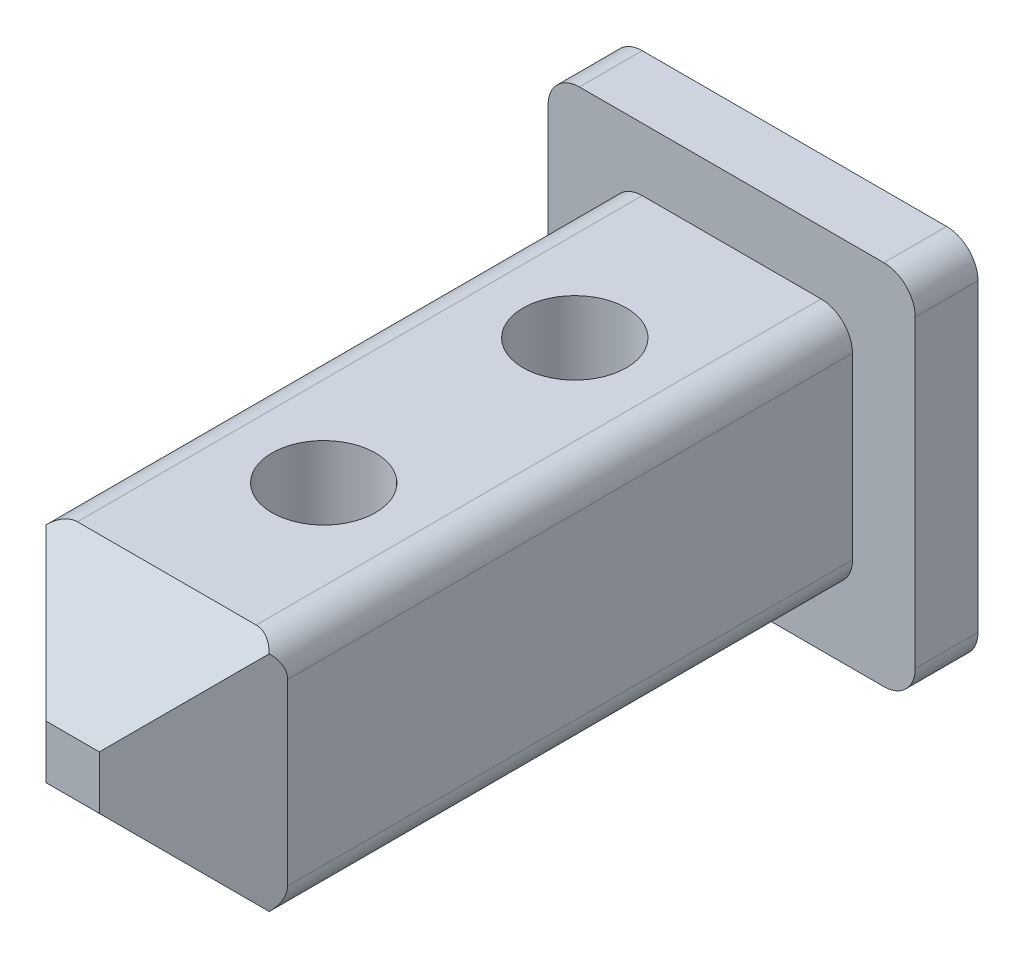
ISO-10303-21;
HEADER;
FILE_DESCRIPTION(('STEP AP214'),'2;1');
FILE_NAME('part.step','',(''),(''),'','','');
FILE_SCHEMA(('AUTOMOTIVE_DESIGN { 1 0 10303 214 1 1 1 1 }'));
ENDSEC;
DATA;
#1=APPLICATION_CONTEXT('core data for automotive mechanical design processes');
#2=APPLICATION_PROTOCOL_DEFINITION('international standard','automotive_design',2000,#1);
#3=PRODUCT_CONTEXT('',#1,'mechanical');
#4=PRODUCT('Part','Part','',(#3));
#5=PRODUCT_RELATED_PRODUCT_CATEGORY('part','',(#4));
#6=PRODUCT_DEFINITION_FORMATION('','',#4);
#7=PRODUCT_DEFINITION_CONTEXT('part definition',#1,'design');
#8=PRODUCT_DEFINITION('design','',#6,#7);
#9=PRODUCT_DEFINITION_SHAPE('','',#8);
#10=(LENGTH_UNIT() NAMED_UNIT(*) SI_UNIT(.MILLI.,.METRE.));
#11=(NAMED_UNIT(*) PLANE_ANGLE_UNIT() SI_UNIT($,.RADIAN.));
#12=(NAMED_UNIT(*) SI_UNIT($,.STERADIAN.) SOLID_ANGLE_UNIT());
#13=UNCERTAINTY_MEASURE_WITH_UNIT(LENGTH_MEASURE(1.E-05),#10,'distance_accuracy_value','');
#14=(GEOMETRIC_REPRESENTATION_CONTEXT(3) GLOBAL_UNCERTAINTY_ASSIGNED_CONTEXT((#13)) GLOBAL_UNIT_ASSIGNED_CONTEXT((#10,
#11,#12)) REPRESENTATION_CONTEXT('',''));
#15=CARTESIAN_POINT('',(0.,0.,0.));
#16=DIRECTION('',(0.,0.,1.));
#17=DIRECTION('',(1.,0.,0.));
#18=AXIS2_PLACEMENT_3D('',#15,#16,#17);
#19=CARTESIAN_POINT('',(3.85,3.85,21.));
#20=DIRECTION('',(-1.,0.,0.));
#21=DIRECTION('',(0.,-1.,0.));
#22=AXIS2_PLACEMENT_3D('',#19,#20,#21);
#23=PLANE('',#22);
#24=DIRECTION('',(0.,-1.,0.));
#25=VECTOR('',#24,1.);
#26=CARTESIAN_POINT('',(3.85,-3.85,18.));
#27=LINE('',#26,#25);
#28=CARTESIAN_POINT('',(3.85,2.85,18.));
#29=VERTEX_POINT('',#28);
#30=CARTESIAN_POINT('',(3.85,-2.85,18.));
#31=VERTEX_POINT('',#30);
#32=EDGE_CURVE('E213',#29,#31,#27,.T.);
#33=ORIENTED_EDGE('',*,*,#32,.T.);
#34=DIRECTION('',(0.,0.,-1.));
#35=VECTOR('',#34,1.);
#36=CARTESIAN_POINT('',(3.85,-2.85,21.));
#37=LINE('',#36,#35);
#38=CARTESIAN_POINT('',(3.85,-2.85,0.));
#39=VERTEX_POINT('',#38);
#40=EDGE_CURVE('E287',#31,#39,#37,.T.);
#41=ORIENTED_EDGE('',*,*,#40,.T.);
#42=DIRECTION('',(0.,1.,0.));
#43=VECTOR('',#42,1.);
#44=CARTESIAN_POINT('',(3.85,3.85,0.));
#45=LINE('',#44,#43);
#46=CARTESIAN_POINT('',(3.85,2.85,0.));
#47=VERTEX_POINT('',#46);
#48=EDGE_CURVE('E300',#39,#47,#45,.T.);
#49=ORIENTED_EDGE('',*,*,#48,.T.);
#50=DIRECTION('',(0.,0.,-1.));
#51=VECTOR('',#50,1.);
#52=CARTESIAN_POINT('',(3.85,2.85,21.));
#53=LINE('',#52,#51);
#54=EDGE_CURVE('E56',#47,#29,#53,.F.);
#55=ORIENTED_EDGE('',*,*,#54,.T.);
#56=EDGE_LOOP('',(#33,#41,#49,#55));
#57=FACE_BOUND('',#56,.T.);
#58=ADVANCED_FACE('F34',(#57),#23,.F.);
#59=CARTESIAN_POINT('',(-3.85,3.85,21.));
#60=DIRECTION('',(0.,-1.,0.));
#61=DIRECTION('',(1.,0.,0.));
#62=AXIS2_PLACEMENT_3D('',#59,#60,#61);
#63=PLANE('',#62);
#64=CARTESIAN_POINT('',(0.,3.85,5.));
#65=DIRECTION('',(0.,-1.,0.));
#66=DIRECTION('',(1.,0.,0.));
#67=AXIS2_PLACEMENT_3D('',#64,#65,#66);
#68=CIRCLE('',#67,1.65);
#69=CARTESIAN_POINT('',(1.65,3.85,5.));
#70=VERTEX_POINT('',#69);
#71=EDGE_CURVE('E221',#70,#70,#68,.T.);
#72=ORIENTED_EDGE('',*,*,#71,.T.);
#73=EDGE_LOOP('',(#72));
#74=FACE_BOUND('',#73,.T.);
#75=CARTESIAN_POINT('',(0.,3.85,13.));
#76=DIRECTION('',(0.,-1.,0.));
#77=DIRECTION('',(1.,0.,0.));
#78=AXIS2_PLACEMENT_3D('',#75,#76,#77);
#79=CIRCLE('',#78,1.65);
#80=CARTESIAN_POINT('',(1.65,3.85,13.));
#81=VERTEX_POINT('',#80);
#82=EDGE_CURVE('E354',#81,#81,#79,.T.);
#83=ORIENTED_EDGE('',*,*,#82,.T.);
#84=EDGE_LOOP('',(#83));
#85=FACE_BOUND('',#84,.T.);
#86=DIRECTION('',(-1.,0.,0.));
#87=VECTOR('',#86,1.);
#88=CARTESIAN_POINT('',(-3.85,3.85,0.));
#89=LINE('',#88,#87);
#90=CARTESIAN_POINT('',(2.85,3.85,0.));
#91=VERTEX_POINT('',#90);
#92=CARTESIAN_POINT('',(-2.85,3.85,0.));
#93=VERTEX_POINT('',#92);
#94=EDGE_CURVE('E324',#91,#93,#89,.T.);
#95=ORIENTED_EDGE('',*,*,#94,.T.);
#96=DIRECTION('',(0.,0.,-1.));
#97=VECTOR('',#96,1.);
#98=CARTESIAN_POINT('',(-2.85,3.85,21.));
#99=LINE('',#98,#97);
#100=CARTESIAN_POINT('',(-2.85,3.85,18.));
#101=VERTEX_POINT('',#100);
#102=EDGE_CURVE('E267',#93,#101,#99,.F.);
#103=ORIENTED_EDGE('',*,*,#102,.T.);
#104=DIRECTION('',(1.,0.,0.));
#105=VECTOR('',#104,1.);
#106=CARTESIAN_POINT('',(3.85,3.85,18.));
#107=LINE('',#106,#105);
#108=CARTESIAN_POINT('',(2.85,3.85,18.));
#109=VERTEX_POINT('',#108);
#110=EDGE_CURVE('E215',#101,#109,#107,.T.);
#111=ORIENTED_EDGE('',*,*,#110,.T.);
#112=DIRECTION('',(0.,0.,-1.));
#113=VECTOR('',#112,1.);
#114=CARTESIAN_POINT('',(2.85,3.85,21.));
#115=LINE('',#114,#113);
#116=EDGE_CURVE('E264',#109,#91,#115,.T.);
#117=ORIENTED_EDGE('',*,*,#116,.T.);
#118=EDGE_LOOP('',(#95,#103,#111,#117));
#119=FACE_BOUND('',#118,.T.);
#120=ADVANCED_FACE('F378',(#74,#85,#119),#63,.F.);
#121=CARTESIAN_POINT('',(-3.85,3.85,21.));
#122=DIRECTION('',(1.,0.,0.));
#123=DIRECTION('',(0.,1.,0.));
#124=AXIS2_PLACEMENT_3D('',#121,#122,#123);
#125=PLANE('',#124);
#126=DIRECTION('',(0.,1.,0.));
#127=VECTOR('',#126,1.);
#128=CARTESIAN_POINT('',(-3.85,3.85,18.));
#129=LINE('',#128,#127);
#130=CARTESIAN_POINT('',(-3.85,-2.85,18.));
#131=VERTEX_POINT('',#130);
#132=CARTESIAN_POINT('',(-3.85,2.85,18.));
#133=VERTEX_POINT('',#132);
#134=EDGE_CURVE('E207',#131,#133,#129,.T.);
#135=ORIENTED_EDGE('',*,*,#134,.T.);
#136=DIRECTION('',(0.,0.,-1.));
#137=VECTOR('',#136,1.);
#138=CARTESIAN_POINT('',(-3.85,2.85,21.));
#139=LINE('',#138,#137);
#140=CARTESIAN_POINT('',(-3.85,2.85,0.));
#141=VERTEX_POINT('',#140);
#142=EDGE_CURVE('E261',#133,#141,#139,.T.);
#143=ORIENTED_EDGE('',*,*,#142,.T.);
#144=DIRECTION('',(0.,-1.,0.));
#145=VECTOR('',#144,1.);
#146=CARTESIAN_POINT('',(-3.85,3.85,0.));
#147=LINE('',#146,#145);
#148=CARTESIAN_POINT('',(-3.85,-2.85,0.));
#149=VERTEX_POINT('',#148);
#150=EDGE_CURVE('E200',#141,#149,#147,.T.);
#151=ORIENTED_EDGE('',*,*,#150,.T.);
#152=DIRECTION('',(0.,0.,-1.));
#153=VECTOR('',#152,1.);
#154=CARTESIAN_POINT('',(-3.85,-2.85,21.));
#155=LINE('',#154,#153);
#156=EDGE_CURVE('E259',#149,#131,#155,.F.);
#157=ORIENTED_EDGE('',*,*,#156,.T.);
#158=EDGE_LOOP('',(#135,#143,#151,#157));
#159=FACE_BOUND('',#158,.T.);
#160=ADVANCED_FACE('F321',(#159),#125,.F.);
#161=CARTESIAN_POINT('',(-3.85,-3.85,21.));
#162=DIRECTION('',(0.,1.,0.));
#163=DIRECTION('',(-1.,0.,0.));
#164=AXIS2_PLACEMENT_3D('',#161,#162,#163);
#165=PLANE('',#164);
#166=CARTESIAN_POINT('',(0.,-3.85,5.));
#167=DIRECTION('',(0.,-1.,0.));
#168=DIRECTION('',(1.,0.,0.));
#169=AXIS2_PLACEMENT_3D('',#166,#167,#168);
#170=CIRCLE('',#169,1.65);
#171=CARTESIAN_POINT('',(1.65,-3.85,5.));
#172=VERTEX_POINT('',#171);
#173=EDGE_CURVE('E357',#172,#172,#170,.T.);
#174=ORIENTED_EDGE('',*,*,#173,.F.);
#175=EDGE_LOOP('',(#174));
#176=FACE_BOUND('',#175,.T.);
#177=CARTESIAN_POINT('',(0.,-3.85,13.));
#178=DIRECTION('',(0.,-1.,0.));
#179=DIRECTION('',(1.,0.,0.));
#180=AXIS2_PLACEMENT_3D('',#177,#178,#179);
#181=CIRCLE('',#180,1.65);
#182=CARTESIAN_POINT('',(1.65,-3.85,13.));
#183=VERTEX_POINT('',#182);
#184=EDGE_CURVE('E358',#183,#183,#181,.T.);
#185=ORIENTED_EDGE('',*,*,#184,.F.);
#186=EDGE_LOOP('',(#185));
#187=FACE_BOUND('',#186,.T.);
#188=DIRECTION('',(-1.,0.,0.));
#189=VECTOR('',#188,1.);
#190=CARTESIAN_POINT('',(-3.85,-3.85,18.));
#191=LINE('',#190,#189);
#192=CARTESIAN_POINT('',(2.85,-3.85,18.));
#193=VERTEX_POINT('',#192);
#194=CARTESIAN_POINT('',(-2.85,-3.85,18.));
#195=VERTEX_POINT('',#194);
#196=EDGE_CURVE('E210',#193,#195,#191,.T.);
#197=ORIENTED_EDGE('',*,*,#196,.T.);
#198=DIRECTION('',(0.,0.,-1.));
#199=VECTOR('',#198,1.);
#200=CARTESIAN_POINT('',(-2.85,-3.85,21.));
#201=LINE('',#200,#199);
#202=CARTESIAN_POINT('',(-2.85,-3.85,0.));
#203=VERTEX_POINT('',#202);
#204=EDGE_CURVE('E279',#195,#203,#201,.T.);
#205=ORIENTED_EDGE('',*,*,#204,.T.);
#206=DIRECTION('',(1.,0.,0.));
#207=VECTOR('',#206,1.);
#208=CARTESIAN_POINT('',(-3.85,-3.85,0.));
#209=LINE('',#208,#207);
#210=CARTESIAN_POINT('',(2.85,-3.85,0.));
#211=VERTEX_POINT('',#210);
#212=EDGE_CURVE('E197',#203,#211,#209,.T.);
#213=ORIENTED_EDGE('',*,*,#212,.T.);
#214=DIRECTION('',(0.,0.,-1.));
#215=VECTOR('',#214,1.);
#216=CARTESIAN_POINT('',(2.85,-3.85,21.));
#217=LINE('',#216,#215);
#218=EDGE_CURVE('E277',#211,#193,#217,.F.);
#219=ORIENTED_EDGE('',*,*,#218,.T.);
#220=EDGE_LOOP('',(#197,#205,#213,#219));
#221=FACE_BOUND('',#220,.T.);
#222=ADVANCED_FACE('F305',(#176,#187,#221),#165,.F.);
#223=CARTESIAN_POINT('',(0.,0.,21.));
#224=DIRECTION('',(0.,0.,1.));
#225=DIRECTION('',(1.,0.,0.));
#226=AXIS2_PLACEMENT_3D('',#223,#224,#225);
#227=PLANE('',#226);
#228=DIRECTION('',(-1.,0.,0.));
#229=VECTOR('',#228,1.);
#230=CARTESIAN_POINT('',(-3.85,0.849999999999999,21.));
#231=LINE('',#230,#229);
#232=CARTESIAN_POINT('',(0.849999999999997,0.849999999999999,21.));
#233=VERTEX_POINT('',#232);
#234=CARTESIAN_POINT('',(-0.849999999999998,0.849999999999999,21.));
#235=VERTEX_POINT('',#234);
#236=EDGE_CURVE('E177',#233,#235,#231,.T.);
#237=ORIENTED_EDGE('',*,*,#236,.T.);
#238=DIRECTION('',(0.,-1.,0.));
#239=VECTOR('',#238,1.);
#240=CARTESIAN_POINT('',(-0.849999999999997,-3.85,21.));
#241=LINE('',#240,#239);
#242=CARTESIAN_POINT('',(-0.849999999999998,-0.849999999999997,21.));
#243=VERTEX_POINT('',#242);
#244=EDGE_CURVE('E205',#235,#243,#241,.T.);
#245=ORIENTED_EDGE('',*,*,#244,.T.);
#246=DIRECTION('',(1.,0.,0.));
#247=VECTOR('',#246,1.);
#248=CARTESIAN_POINT('',(3.85,-0.849999999999997,21.));
#249=LINE('',#248,#247);
#250=CARTESIAN_POINT('',(0.849999999999997,-0.849999999999997,21.));
#251=VERTEX_POINT('',#250);
#252=EDGE_CURVE('E180',#243,#251,#249,.T.);
#253=ORIENTED_EDGE('',*,*,#252,.T.);
#254=DIRECTION('',(0.,1.,0.));
#255=VECTOR('',#254,1.);
#256=CARTESIAN_POINT('',(0.849999999999997,3.85,21.));
#257=LINE('',#256,#255);
#258=EDGE_CURVE('E172',#251,#233,#257,.T.);
#259=ORIENTED_EDGE('',*,*,#258,.T.);
#260=EDGE_LOOP('',(#237,#245,#253,#259));
#261=FACE_BOUND('',#260,.T.);
#262=ADVANCED_FACE('F174',(#261),#227,.T.);
#263=CARTESIAN_POINT('',(-5.85,5.85,-2.));
#264=DIRECTION('',(1.,0.,0.));
#265=DIRECTION('',(0.,0.,-1.));
#266=AXIS2_PLACEMENT_3D('',#263,#264,#265);
#267=PLANE('',#266);
#268=DIRECTION('',(0.,1.,0.));
#269=VECTOR('',#268,1.);
#270=CARTESIAN_POINT('',(-5.85,5.85,0.));
#271=LINE('',#270,#269);
#272=CARTESIAN_POINT('',(-5.85,-4.85,0.));
#273=VERTEX_POINT('',#272);
#274=CARTESIAN_POINT('',(-5.85,4.85,0.));
#275=VERTEX_POINT('',#274);
#276=EDGE_CURVE('E189',#273,#275,#271,.T.);
#277=ORIENTED_EDGE('',*,*,#276,.T.);
#278=DIRECTION('',(0.,0.,1.));
#279=VECTOR('',#278,1.);
#280=CARTESIAN_POINT('',(-5.85,4.85,-2.));
#281=LINE('',#280,#279);
#282=CARTESIAN_POINT('',(-5.85,4.85,-2.));
#283=VERTEX_POINT('',#282);
#284=EDGE_CURVE('E239',#275,#283,#281,.F.);
#285=ORIENTED_EDGE('',*,*,#284,.T.);
#286=DIRECTION('',(0.,1.,0.));
#287=VECTOR('',#286,1.);
#288=CARTESIAN_POINT('',(-5.85,5.85,-2.));
#289=LINE('',#288,#287);
#290=CARTESIAN_POINT('',(-5.85,-4.85,-2.));
#291=VERTEX_POINT('',#290);
#292=EDGE_CURVE('E333',#291,#283,#289,.T.);
#293=ORIENTED_EDGE('',*,*,#292,.F.);
#294=DIRECTION('',(0.,0.,1.));
#295=VECTOR('',#294,1.);
#296=CARTESIAN_POINT('',(-5.85,-4.85,-2.));
#297=LINE('',#296,#295);
#298=EDGE_CURVE('E236',#291,#273,#297,.T.);
#299=ORIENTED_EDGE('',*,*,#298,.T.);
#300=EDGE_LOOP('',(#277,#285,#293,#299));
#301=FACE_BOUND('',#300,.T.);
#302=ADVANCED_FACE('F412',(#301),#267,.F.);
#303=CARTESIAN_POINT('',(5.85,5.85,-2.));
#304=DIRECTION('',(0.,-1.,0.));
#305=DIRECTION('',(0.,0.,-1.));
#306=AXIS2_PLACEMENT_3D('',#303,#304,#305);
#307=PLANE('',#306);
#308=DIRECTION('',(1.,0.,0.));
#309=VECTOR('',#308,1.);
#310=CARTESIAN_POINT('',(5.85,5.85,-2.));
#311=LINE('',#310,#309);
#312=CARTESIAN_POINT('',(-4.85,5.85,-2.));
#313=VERTEX_POINT('',#312);
#314=CARTESIAN_POINT('',(4.85,5.85,-2.));
#315=VERTEX_POINT('',#314);
#316=EDGE_CURVE('E347',#313,#315,#311,.T.);
#317=ORIENTED_EDGE('',*,*,#316,.F.);
#318=DIRECTION('',(0.,0.,1.));
#319=VECTOR('',#318,1.);
#320=CARTESIAN_POINT('',(-4.85,5.85,-2.));
#321=LINE('',#320,#319);
#322=CARTESIAN_POINT('',(-4.85,5.85,0.));
#323=VERTEX_POINT('',#322);
#324=EDGE_CURVE('E225',#313,#323,#321,.T.);
#325=ORIENTED_EDGE('',*,*,#324,.T.);
#326=DIRECTION('',(1.,0.,0.));
#327=VECTOR('',#326,1.);
#328=CARTESIAN_POINT('',(5.85,5.85,0.));
#329=LINE('',#328,#327);
#330=CARTESIAN_POINT('',(4.85,5.85,0.));
#331=VERTEX_POINT('',#330);
#332=EDGE_CURVE('E337',#323,#331,#329,.T.);
#333=ORIENTED_EDGE('',*,*,#332,.T.);
#334=DIRECTION('',(0.,0.,1.));
#335=VECTOR('',#334,1.);
#336=CARTESIAN_POINT('',(4.85,5.85,-2.));
#337=LINE('',#336,#335);
#338=EDGE_CURVE('E218',#331,#315,#337,.F.);
#339=ORIENTED_EDGE('',*,*,#338,.T.);
#340=EDGE_LOOP('',(#317,#325,#333,#339));
#341=FACE_BOUND('',#340,.T.);
#342=ADVANCED_FACE('F415',(#341),#307,.F.);
#343=CARTESIAN_POINT('',(5.85,5.85,-2.));
#344=DIRECTION('',(-1.,0.,0.));
#345=DIRECTION('',(0.,-1.,0.));
#346=AXIS2_PLACEMENT_3D('',#343,#344,#345);
#347=PLANE('',#346);
#348=DIRECTION('',(0.,-1.,0.));
#349=VECTOR('',#348,1.);
#350=CARTESIAN_POINT('',(5.85,5.85,-2.));
#351=LINE('',#350,#349);
#352=CARTESIAN_POINT('',(5.85,4.85,-2.));
#353=VERTEX_POINT('',#352);
#354=CARTESIAN_POINT('',(5.85,-4.85,-2.));
#355=VERTEX_POINT('',#354);
#356=EDGE_CURVE('E344',#353,#355,#351,.T.);
#357=ORIENTED_EDGE('',*,*,#356,.F.);
#358=DIRECTION('',(0.,0.,1.));
#359=VECTOR('',#358,1.);
#360=CARTESIAN_POINT('',(5.85,4.85,-2.));
#361=LINE('',#360,#359);
#362=CARTESIAN_POINT('',(5.85,4.85,0.));
#363=VERTEX_POINT('',#362);
#364=EDGE_CURVE('E251',#353,#363,#361,.T.);
#365=ORIENTED_EDGE('',*,*,#364,.T.);
#366=DIRECTION('',(0.,-1.,0.));
#367=VECTOR('',#366,1.);
#368=CARTESIAN_POINT('',(5.85,5.85,0.));
#369=LINE('',#368,#367);
#370=CARTESIAN_POINT('',(5.85,-4.85,0.));
#371=VERTEX_POINT('',#370);
#372=EDGE_CURVE('E334',#363,#371,#369,.T.);
#373=ORIENTED_EDGE('',*,*,#372,.T.);
#374=DIRECTION('',(0.,0.,1.));
#375=VECTOR('',#374,1.);
#376=CARTESIAN_POINT('',(5.85,-4.85,-2.));
#377=LINE('',#376,#375);
#378=EDGE_CURVE('E249',#371,#355,#377,.F.);
#379=ORIENTED_EDGE('',*,*,#378,.T.);
#380=EDGE_LOOP('',(#357,#365,#373,#379));
#381=FACE_BOUND('',#380,.T.);
#382=ADVANCED_FACE('F419',(#381),#347,.F.);
#383=CARTESIAN_POINT('',(5.85,-5.85,-2.));
#384=DIRECTION('',(0.,1.,0.));
#385=DIRECTION('',(0.,0.,1.));
#386=AXIS2_PLACEMENT_3D('',#383,#384,#385);
#387=PLANE('',#386);
#388=DIRECTION('',(-1.,0.,0.));
#389=VECTOR('',#388,1.);
#390=CARTESIAN_POINT('',(5.85,-5.85,0.));
#391=LINE('',#390,#389);
#392=CARTESIAN_POINT('',(4.85,-5.85,0.));
#393=VERTEX_POINT('',#392);
#394=CARTESIAN_POINT('',(-4.85,-5.85,0.));
#395=VERTEX_POINT('',#394);
#396=EDGE_CURVE('E330',#393,#395,#391,.T.);
#397=ORIENTED_EDGE('',*,*,#396,.T.);
#398=DIRECTION('',(0.,0.,1.));
#399=VECTOR('',#398,1.);
#400=CARTESIAN_POINT('',(-4.85,-5.85,-2.));
#401=LINE('',#400,#399);
#402=CARTESIAN_POINT('',(-4.85,-5.85,-2.));
#403=VERTEX_POINT('',#402);
#404=EDGE_CURVE('E257',#395,#403,#401,.F.);
#405=ORIENTED_EDGE('',*,*,#404,.T.);
#406=DIRECTION('',(-1.,0.,0.));
#407=VECTOR('',#406,1.);
#408=CARTESIAN_POINT('',(5.85,-5.85,-2.));
#409=LINE('',#408,#407);
#410=CARTESIAN_POINT('',(4.85,-5.85,-2.));
#411=VERTEX_POINT('',#410);
#412=EDGE_CURVE('E329',#411,#403,#409,.T.);
#413=ORIENTED_EDGE('',*,*,#412,.F.);
#414=DIRECTION('',(0.,0.,1.));
#415=VECTOR('',#414,1.);
#416=CARTESIAN_POINT('',(4.85,-5.85,-2.));
#417=LINE('',#416,#415);
#418=EDGE_CURVE('E254',#411,#393,#417,.T.);
#419=ORIENTED_EDGE('',*,*,#418,.T.);
#420=EDGE_LOOP('',(#397,#405,#413,#419));
#421=FACE_BOUND('',#420,.T.);
#422=ADVANCED_FACE('F423',(#421),#387,.F.);
#423=CARTESIAN_POINT('',(0.,0.,-2.));
#424=DIRECTION('',(0.,0.,-1.));
#425=DIRECTION('',(-1.,0.,0.));
#426=AXIS2_PLACEMENT_3D('',#423,#424,#425);
#427=PLANE('',#426);
#428=ORIENTED_EDGE('',*,*,#292,.T.);
#429=CARTESIAN_POINT('',(-4.85,4.85,-2.));
#430=DIRECTION('',(0.,0.,-1.));
#431=DIRECTION('',(-1.,0.,0.));
#432=AXIS2_PLACEMENT_3D('',#429,#430,#431);
#433=CIRCLE('',#432,1.);
#434=EDGE_CURVE('E247',#283,#313,#433,.T.);
#435=ORIENTED_EDGE('',*,*,#434,.T.);
#436=ORIENTED_EDGE('',*,*,#316,.T.);
#437=CARTESIAN_POINT('',(4.85,4.85,-2.));
#438=DIRECTION('',(0.,0.,-1.));
#439=DIRECTION('',(-1.,0.,0.));
#440=AXIS2_PLACEMENT_3D('',#437,#438,#439);
#441=CIRCLE('',#440,1.);
#442=EDGE_CURVE('E245',#315,#353,#441,.T.);
#443=ORIENTED_EDGE('',*,*,#442,.T.);
#444=ORIENTED_EDGE('',*,*,#356,.T.);
#445=CARTESIAN_POINT('',(4.85,-4.85,-2.));
#446=DIRECTION('',(0.,0.,-1.));
#447=DIRECTION('',(-1.,0.,0.));
#448=AXIS2_PLACEMENT_3D('',#445,#446,#447);
#449=CIRCLE('',#448,1.);
#450=EDGE_CURVE('E241',#355,#411,#449,.T.);
#451=ORIENTED_EDGE('',*,*,#450,.T.);
#452=ORIENTED_EDGE('',*,*,#412,.T.);
#453=CARTESIAN_POINT('',(-4.85,-4.85,-2.));
#454=DIRECTION('',(0.,0.,-1.));
#455=DIRECTION('',(-1.,0.,0.));
#456=AXIS2_PLACEMENT_3D('',#453,#454,#455);
#457=CIRCLE('',#456,1.);
#458=EDGE_CURVE('E243',#403,#291,#457,.T.);
#459=ORIENTED_EDGE('',*,*,#458,.T.);
#460=EDGE_LOOP('',(#428,#435,#436,#443,#444,#451,#452,#459));
#461=FACE_BOUND('',#460,.T.);
#462=ADVANCED_FACE('F427',(#461),#427,.T.);
#463=CARTESIAN_POINT('',(0.,0.,0.));
#464=DIRECTION('',(0.,0.,-1.));
#465=DIRECTION('',(-1.,0.,0.));
#466=AXIS2_PLACEMENT_3D('',#463,#464,#465);
#467=PLANE('',#466);
#468=ORIENTED_EDGE('',*,*,#48,.F.);
#469=CARTESIAN_POINT('',(2.85,-2.85,0.));
#470=DIRECTION('',(0.,0.,-1.));
#471=DIRECTION('',(-1.,0.,0.));
#472=AXIS2_PLACEMENT_3D('',#469,#470,#471);
#473=CIRCLE('',#472,1.);
#474=EDGE_CURVE('E42',#39,#211,#473,.T.);
#475=ORIENTED_EDGE('',*,*,#474,.T.);
#476=ORIENTED_EDGE('',*,*,#212,.F.);
#477=CARTESIAN_POINT('',(-2.85,-2.85,0.));
#478=DIRECTION('',(0.,0.,-1.));
#479=DIRECTION('',(-1.,0.,0.));
#480=AXIS2_PLACEMENT_3D('',#477,#478,#479);
#481=CIRCLE('',#480,1.);
#482=EDGE_CURVE('E294',#203,#149,#481,.T.);
#483=ORIENTED_EDGE('',*,*,#482,.T.);
#484=ORIENTED_EDGE('',*,*,#150,.F.);
#485=CARTESIAN_POINT('',(-2.85,2.85,0.));
#486=DIRECTION('',(0.,0.,-1.));
#487=DIRECTION('',(-1.,0.,0.));
#488=AXIS2_PLACEMENT_3D('',#485,#486,#487);
#489=CIRCLE('',#488,1.);
#490=EDGE_CURVE('E292',#141,#93,#489,.T.);
#491=ORIENTED_EDGE('',*,*,#490,.T.);
#492=ORIENTED_EDGE('',*,*,#94,.F.);
#493=CARTESIAN_POINT('',(2.85,2.85,0.));
#494=DIRECTION('',(0.,0.,-1.));
#495=DIRECTION('',(-1.,0.,0.));
#496=AXIS2_PLACEMENT_3D('',#493,#494,#495);
#497=CIRCLE('',#496,1.);
#498=EDGE_CURVE('E11',#91,#47,#497,.T.);
#499=ORIENTED_EDGE('',*,*,#498,.T.);
#500=EDGE_LOOP('',(#468,#475,#476,#483,#484,#491,#492,#499));
#501=FACE_BOUND('',#500,.T.);
#502=ORIENTED_EDGE('',*,*,#332,.F.);
#503=CARTESIAN_POINT('',(-4.85,4.85,0.));
#504=DIRECTION('',(0.,0.,-1.));
#505=DIRECTION('',(-1.,0.,0.));
#506=AXIS2_PLACEMENT_3D('',#503,#504,#505);
#507=CIRCLE('',#506,1.);
#508=EDGE_CURVE('E234',#323,#275,#507,.F.);
#509=ORIENTED_EDGE('',*,*,#508,.T.);
#510=ORIENTED_EDGE('',*,*,#276,.F.);
#511=CARTESIAN_POINT('',(-4.85,-4.85,0.));
#512=DIRECTION('',(0.,0.,-1.));
#513=DIRECTION('',(-1.,0.,0.));
#514=AXIS2_PLACEMENT_3D('',#511,#512,#513);
#515=CIRCLE('',#514,1.);
#516=EDGE_CURVE('E230',#273,#395,#515,.F.);
#517=ORIENTED_EDGE('',*,*,#516,.T.);
#518=ORIENTED_EDGE('',*,*,#396,.F.);
#519=CARTESIAN_POINT('',(4.85,-4.85,0.));
#520=DIRECTION('',(0.,0.,-1.));
#521=DIRECTION('',(-1.,0.,0.));
#522=AXIS2_PLACEMENT_3D('',#519,#520,#521);
#523=CIRCLE('',#522,1.);
#524=EDGE_CURVE('E228',#393,#371,#523,.F.);
#525=ORIENTED_EDGE('',*,*,#524,.T.);
#526=ORIENTED_EDGE('',*,*,#372,.F.);
#527=CARTESIAN_POINT('',(4.85,4.85,0.));
#528=DIRECTION('',(0.,0.,-1.));
#529=DIRECTION('',(-1.,0.,0.));
#530=AXIS2_PLACEMENT_3D('',#527,#528,#529);
#531=CIRCLE('',#530,1.);
#532=EDGE_CURVE('E232',#363,#331,#531,.F.);
#533=ORIENTED_EDGE('',*,*,#532,.T.);
#534=EDGE_LOOP('',(#502,#509,#510,#517,#518,#525,#526,#533));
#535=FACE_BOUND('',#534,.T.);
#536=ADVANCED_FACE('F298',(#501,#535),#467,.F.);
#537=CARTESIAN_POINT('',(0.849999999999997,0.,21.));
#538=DIRECTION('',(0.707106781186549,0.,0.707106781186546));
#539=DIRECTION('',(0.,-1.,0.));
#540=AXIS2_PLACEMENT_3D('',#537,#538,#539);
#541=PLANE('',#540);
#542=DIRECTION('',(0.577350269189625,-0.577350269189625,-0.577350269189627));
#543=VECTOR('',#542,1.);
#544=CARTESIAN_POINT('',(0.566666666666665,-0.566666666666665,21.2833333333333));
#545=LINE('',#544,#543);
#546=CARTESIAN_POINT('',(3.55710678118655,-3.55710678118655,18.2928932188134));
#547=VERTEX_POINT('',#546);
#548=EDGE_CURVE('E190',#547,#251,#545,.F.);
#549=ORIENTED_EDGE('',*,*,#548,.F.);
#550=CARTESIAN_POINT('',(2.85,-2.85,19.));
#551=DIRECTION('',(0.707106781186549,0.,0.707106781186546));
#552=DIRECTION('',(0.707106781186546,0.,-0.707106781186549));
#553=AXIS2_PLACEMENT_3D('',#550,#551,#552);
#554=ELLIPSE('',#553,1.4142135623731,1.);
#555=EDGE_CURVE('E49',#547,#31,#554,.T.);
#556=ORIENTED_EDGE('',*,*,#555,.T.);
#557=ORIENTED_EDGE('',*,*,#32,.F.);
#558=CARTESIAN_POINT('',(2.85,2.85,19.));
#559=DIRECTION('',(0.707106781186549,0.,0.707106781186546));
#560=DIRECTION('',(0.707106781186546,0.,-0.707106781186549));
#561=AXIS2_PLACEMENT_3D('',#558,#559,#560);
#562=ELLIPSE('',#561,1.4142135623731,1.);
#563=CARTESIAN_POINT('',(3.55710678118655,3.55710678118655,18.2928932188134));
#564=VERTEX_POINT('',#563);
#565=EDGE_CURVE('E186',#29,#564,#562,.T.);
#566=ORIENTED_EDGE('',*,*,#565,.T.);
#567=DIRECTION('',(0.577350269189625,0.577350269189625,-0.577350269189627));
#568=VECTOR('',#567,1.);
#569=CARTESIAN_POINT('',(0.566666666666665,0.566666666666667,21.2833333333333));
#570=LINE('',#569,#568);
#571=EDGE_CURVE('E183',#233,#564,#570,.T.);
#572=ORIENTED_EDGE('',*,*,#571,.F.);
#573=ORIENTED_EDGE('',*,*,#258,.F.);
#574=EDGE_LOOP('',(#549,#556,#557,#566,#572,#573));
#575=FACE_BOUND('',#574,.T.);
#576=ADVANCED_FACE('F184',(#575),#541,.T.);
#577=CARTESIAN_POINT('',(0.,0.849999999999999,21.));
#578=DIRECTION('',(0.,0.707106781186549,0.707106781186546));
#579=DIRECTION('',(1.,0.,0.));
#580=AXIS2_PLACEMENT_3D('',#577,#578,#579);
#581=PLANE('',#580);
#582=ORIENTED_EDGE('',*,*,#110,.F.);
#583=CARTESIAN_POINT('',(-2.85,2.85,19.));
#584=DIRECTION('',(0.,0.707106781186549,0.707106781186546));
#585=DIRECTION('',(0.,0.707106781186546,-0.707106781186549));
#586=AXIS2_PLACEMENT_3D('',#583,#584,#585);
#587=ELLIPSE('',#586,1.4142135623731,1.);
#588=CARTESIAN_POINT('',(-3.55710678118655,3.55710678118655,18.2928932188134));
#589=VERTEX_POINT('',#588);
#590=EDGE_CURVE('E271',#101,#589,#587,.T.);
#591=ORIENTED_EDGE('',*,*,#590,.T.);
#592=DIRECTION('',(0.577350269189625,-0.577350269189625,0.577350269189627));
#593=VECTOR('',#592,1.);
#594=CARTESIAN_POINT('',(-0.566666666666666,0.566666666666667,21.2833333333333));
#595=LINE('',#594,#593);
#596=EDGE_CURVE('E195',#235,#589,#595,.F.);
#597=ORIENTED_EDGE('',*,*,#596,.F.);
#598=ORIENTED_EDGE('',*,*,#236,.F.);
#599=ORIENTED_EDGE('',*,*,#571,.T.);
#600=CARTESIAN_POINT('',(2.85,2.85,19.));
#601=DIRECTION('',(0.,0.707106781186549,0.707106781186546));
#602=DIRECTION('',(0.,0.707106781186546,-0.707106781186549));
#603=AXIS2_PLACEMENT_3D('',#600,#601,#602);
#604=ELLIPSE('',#603,1.4142135623731,1.);
#605=EDGE_CURVE('E269',#564,#109,#604,.T.);
#606=ORIENTED_EDGE('',*,*,#605,.T.);
#607=EDGE_LOOP('',(#582,#591,#597,#598,#599,#606));
#608=FACE_BOUND('',#607,.T.);
#609=ADVANCED_FACE('F193',(#608),#581,.T.);
#610=CARTESIAN_POINT('',(0.,-0.849999999999997,21.));
#611=DIRECTION('',(0.,-0.707106781186549,0.707106781186546));
#612=DIRECTION('',(-1.,0.,0.));
#613=AXIS2_PLACEMENT_3D('',#610,#611,#612);
#614=PLANE('',#613);
#615=DIRECTION('',(-0.577350269189625,-0.577350269189625,-0.577350269189627));
#616=VECTOR('',#615,1.);
#617=CARTESIAN_POINT('',(-0.566666666666666,-0.566666666666665,21.2833333333333));
#618=LINE('',#617,#616);
#619=CARTESIAN_POINT('',(-3.55710678118655,-3.55710678118655,18.2928932188134));
#620=VERTEX_POINT('',#619);
#621=EDGE_CURVE('E219',#620,#243,#618,.F.);
#622=ORIENTED_EDGE('',*,*,#621,.F.);
#623=CARTESIAN_POINT('',(-2.85,-2.85,19.));
#624=DIRECTION('',(0.,-0.707106781186549,0.707106781186546));
#625=DIRECTION('',(0.,-0.707106781186546,-0.707106781186549));
#626=AXIS2_PLACEMENT_3D('',#623,#624,#625);
#627=ELLIPSE('',#626,1.4142135623731,1.);
#628=EDGE_CURVE('E284',#620,#195,#627,.T.);
#629=ORIENTED_EDGE('',*,*,#628,.T.);
#630=ORIENTED_EDGE('',*,*,#196,.F.);
#631=CARTESIAN_POINT('',(2.85,-2.85,19.));
#632=DIRECTION('',(0.,-0.707106781186549,0.707106781186546));
#633=DIRECTION('',(0.,-0.707106781186546,-0.707106781186549));
#634=AXIS2_PLACEMENT_3D('',#631,#632,#633);
#635=ELLIPSE('',#634,1.4142135623731,1.);
#636=EDGE_CURVE('E282',#193,#547,#635,.T.);
#637=ORIENTED_EDGE('',*,*,#636,.T.);
#638=ORIENTED_EDGE('',*,*,#548,.T.);
#639=ORIENTED_EDGE('',*,*,#252,.F.);
#640=EDGE_LOOP('',(#622,#629,#630,#637,#638,#639));
#641=FACE_BOUND('',#640,.T.);
#642=ADVANCED_FACE('F312',(#641),#614,.T.);
#643=CARTESIAN_POINT('',(-0.849999999999998,0.,21.));
#644=DIRECTION('',(-0.707106781186549,0.,0.707106781186546));
#645=DIRECTION('',(0.,1.,0.));
#646=AXIS2_PLACEMENT_3D('',#643,#644,#645);
#647=PLANE('',#646);
#648=ORIENTED_EDGE('',*,*,#596,.T.);
#649=CARTESIAN_POINT('',(-2.85,2.85,19.));
#650=DIRECTION('',(-0.707106781186549,0.,0.707106781186546));
#651=DIRECTION('',(-0.707106781186546,0.,-0.707106781186549));
#652=AXIS2_PLACEMENT_3D('',#649,#650,#651);
#653=ELLIPSE('',#652,1.4142135623731,1.);
#654=EDGE_CURVE('E275',#589,#133,#653,.T.);
#655=ORIENTED_EDGE('',*,*,#654,.T.);
#656=ORIENTED_EDGE('',*,*,#134,.F.);
#657=CARTESIAN_POINT('',(-2.85,-2.85,19.));
#658=DIRECTION('',(-0.707106781186549,0.,0.707106781186546));
#659=DIRECTION('',(-0.707106781186546,0.,-0.707106781186549));
#660=AXIS2_PLACEMENT_3D('',#657,#658,#659);
#661=ELLIPSE('',#660,1.4142135623731,1.);
#662=EDGE_CURVE('E273',#131,#620,#661,.T.);
#663=ORIENTED_EDGE('',*,*,#662,.T.);
#664=ORIENTED_EDGE('',*,*,#621,.T.);
#665=ORIENTED_EDGE('',*,*,#244,.F.);
#666=EDGE_LOOP('',(#648,#655,#656,#663,#664,#665));
#667=FACE_BOUND('',#666,.T.);
#668=ADVANCED_FACE('F391',(#667),#647,.T.);
#669=CARTESIAN_POINT('',(-4.85,4.85,-2.));
#670=DIRECTION('',(0.,0.,1.));
#671=DIRECTION('',(1.,0.,0.));
#672=AXIS2_PLACEMENT_3D('',#669,#670,#671);
#673=CYLINDRICAL_SURFACE('',#672,1.);
#674=ORIENTED_EDGE('',*,*,#434,.F.);
#675=ORIENTED_EDGE('',*,*,#284,.F.);
#676=ORIENTED_EDGE('',*,*,#508,.F.);
#677=ORIENTED_EDGE('',*,*,#324,.F.);
#678=EDGE_LOOP('',(#674,#675,#676,#677));
#679=FACE_BOUND('',#678,.T.);
#680=ADVANCED_FACE('F393',(#679),#673,.T.);
#681=CARTESIAN_POINT('',(4.85,4.85,-2.));
#682=DIRECTION('',(0.,0.,1.));
#683=DIRECTION('',(1.,0.,0.));
#684=AXIS2_PLACEMENT_3D('',#681,#682,#683);
#685=CYLINDRICAL_SURFACE('',#684,1.);
#686=ORIENTED_EDGE('',*,*,#442,.F.);
#687=ORIENTED_EDGE('',*,*,#338,.F.);
#688=ORIENTED_EDGE('',*,*,#532,.F.);
#689=ORIENTED_EDGE('',*,*,#364,.F.);
#690=EDGE_LOOP('',(#686,#687,#688,#689));
#691=FACE_BOUND('',#690,.T.);
#692=ADVANCED_FACE('F399',(#691),#685,.T.);
#693=CARTESIAN_POINT('',(-4.85,-4.85,-2.));
#694=DIRECTION('',(0.,0.,1.));
#695=DIRECTION('',(1.,0.,0.));
#696=AXIS2_PLACEMENT_3D('',#693,#694,#695);
#697=CYLINDRICAL_SURFACE('',#696,1.);
#698=ORIENTED_EDGE('',*,*,#458,.F.);
#699=ORIENTED_EDGE('',*,*,#404,.F.);
#700=ORIENTED_EDGE('',*,*,#516,.F.);
#701=ORIENTED_EDGE('',*,*,#298,.F.);
#702=EDGE_LOOP('',(#698,#699,#700,#701));
#703=FACE_BOUND('',#702,.T.);
#704=ADVANCED_FACE('F473',(#703),#697,.T.);
#705=CARTESIAN_POINT('',(4.85,-4.85,-2.));
#706=DIRECTION('',(0.,0.,1.));
#707=DIRECTION('',(1.,0.,0.));
#708=AXIS2_PLACEMENT_3D('',#705,#706,#707);
#709=CYLINDRICAL_SURFACE('',#708,1.);
#710=ORIENTED_EDGE('',*,*,#450,.F.);
#711=ORIENTED_EDGE('',*,*,#378,.F.);
#712=ORIENTED_EDGE('',*,*,#524,.F.);
#713=ORIENTED_EDGE('',*,*,#418,.F.);
#714=EDGE_LOOP('',(#710,#711,#712,#713));
#715=FACE_BOUND('',#714,.T.);
#716=ADVANCED_FACE('F466',(#715),#709,.T.);
#717=CARTESIAN_POINT('',(-2.85,2.85,21.));
#718=DIRECTION('',(0.,0.,-1.));
#719=DIRECTION('',(-1.,0.,0.));
#720=AXIS2_PLACEMENT_3D('',#717,#718,#719);
#721=CYLINDRICAL_SURFACE('',#720,1.);
#722=ORIENTED_EDGE('',*,*,#590,.F.);
#723=ORIENTED_EDGE('',*,*,#102,.F.);
#724=ORIENTED_EDGE('',*,*,#490,.F.);
#725=ORIENTED_EDGE('',*,*,#142,.F.);
#726=ORIENTED_EDGE('',*,*,#654,.F.);
#727=EDGE_LOOP('',(#722,#723,#724,#725,#726));
#728=FACE_BOUND('',#727,.T.);
#729=ADVANCED_FACE('F388',(#728),#721,.T.);
#730=CARTESIAN_POINT('',(-2.85,-2.85,21.));
#731=DIRECTION('',(0.,0.,-1.));
#732=DIRECTION('',(-1.,0.,0.));
#733=AXIS2_PLACEMENT_3D('',#730,#731,#732);
#734=CYLINDRICAL_SURFACE('',#733,1.);
#735=ORIENTED_EDGE('',*,*,#662,.F.);
#736=ORIENTED_EDGE('',*,*,#156,.F.);
#737=ORIENTED_EDGE('',*,*,#482,.F.);
#738=ORIENTED_EDGE('',*,*,#204,.F.);
#739=ORIENTED_EDGE('',*,*,#628,.F.);
#740=EDGE_LOOP('',(#735,#736,#737,#738,#739));
#741=FACE_BOUND('',#740,.T.);
#742=ADVANCED_FACE('F316',(#741),#734,.T.);
#743=CARTESIAN_POINT('',(2.85,-2.85,21.));
#744=DIRECTION('',(0.,0.,-1.));
#745=DIRECTION('',(-1.,0.,0.));
#746=AXIS2_PLACEMENT_3D('',#743,#744,#745);
#747=CYLINDRICAL_SURFACE('',#746,1.);
#748=ORIENTED_EDGE('',*,*,#636,.F.);
#749=ORIENTED_EDGE('',*,*,#218,.F.);
#750=ORIENTED_EDGE('',*,*,#474,.F.);
#751=ORIENTED_EDGE('',*,*,#40,.F.);
#752=ORIENTED_EDGE('',*,*,#555,.F.);
#753=EDGE_LOOP('',(#748,#749,#750,#751,#752));
#754=FACE_BOUND('',#753,.T.);
#755=ADVANCED_FACE('F309',(#754),#747,.T.);
#756=CARTESIAN_POINT('',(2.85,2.85,21.));
#757=DIRECTION('',(0.,0.,-1.));
#758=DIRECTION('',(-1.,0.,0.));
#759=AXIS2_PLACEMENT_3D('',#756,#757,#758);
#760=CYLINDRICAL_SURFACE('',#759,1.);
#761=ORIENTED_EDGE('',*,*,#565,.F.);
#762=ORIENTED_EDGE('',*,*,#54,.F.);
#763=ORIENTED_EDGE('',*,*,#498,.F.);
#764=ORIENTED_EDGE('',*,*,#116,.F.);
#765=ORIENTED_EDGE('',*,*,#605,.F.);
#766=EDGE_LOOP('',(#761,#762,#763,#764,#765));
#767=FACE_BOUND('',#766,.T.);
#768=ADVANCED_FACE('F36',(#767),#760,.T.);
#769=CARTESIAN_POINT('',(0.,20.15,13.));
#770=DIRECTION('',(0.,-1.,0.));
#771=DIRECTION('',(1.,0.,0.));
#772=AXIS2_PLACEMENT_3D('',#769,#770,#771);
#773=CYLINDRICAL_SURFACE('',#772,1.65);
#774=ORIENTED_EDGE('',*,*,#184,.T.);
#775=EDGE_LOOP('',(#774));
#776=FACE_BOUND('',#775,.T.);
#777=ORIENTED_EDGE('',*,*,#82,.F.);
#778=EDGE_LOOP('',(#777));
#779=FACE_BOUND('',#778,.T.);
#780=ADVANCED_FACE('F372',(#776,#779),#773,.F.);
#781=CARTESIAN_POINT('',(0.,20.15,5.));
#782=DIRECTION('',(0.,-1.,0.));
#783=DIRECTION('',(1.,0.,0.));
#784=AXIS2_PLACEMENT_3D('',#781,#782,#783);
#785=CYLINDRICAL_SURFACE('',#784,1.65);
#786=ORIENTED_EDGE('',*,*,#173,.T.);
#787=EDGE_LOOP('',(#786));
#788=FACE_BOUND('',#787,.T.);
#789=ORIENTED_EDGE('',*,*,#71,.F.);
#790=EDGE_LOOP('',(#789));
#791=FACE_BOUND('',#790,.T.);
#792=ADVANCED_FACE('F364',(#788,#791),#785,.F.);
#793=CLOSED_SHELL('',(#58,#120,#160,#222,#262,#302,#342,#382,#422,#462,#536,#576,#609,#642,#668,
#680,#692,#704,#716,#729,#742,#755,#768,#780,#792));
#794=MANIFOLD_SOLID_BREP('B2',#793);
#795=ADVANCED_BREP_SHAPE_REPRESENTATION('',(#18,#794),#14);
#796=SHAPE_DEFINITION_REPRESENTATION(#9,#795);
ENDSEC;
END-ISO-10303-21;
